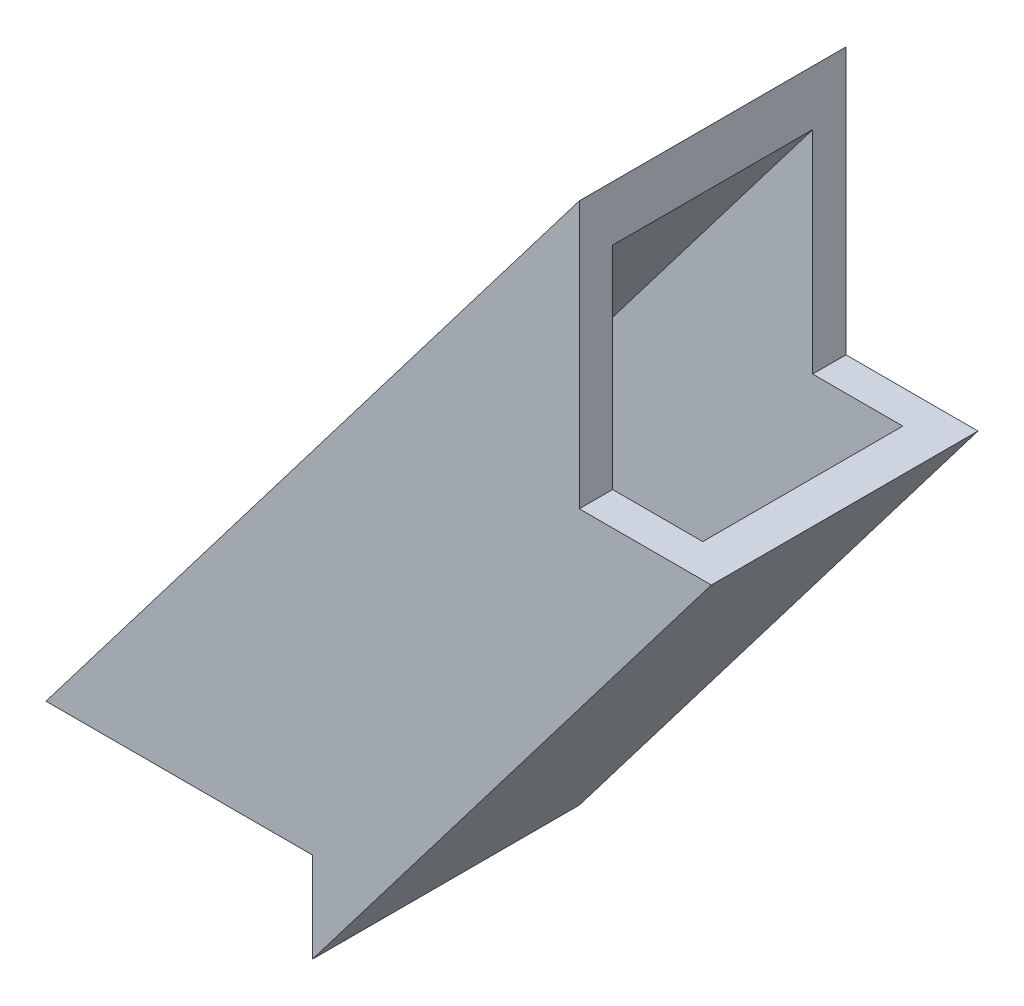
ISO-10303-21;
HEADER;
FILE_DESCRIPTION(('STEP AP214'),'2;1');
FILE_NAME('part.step','',(''),(''),'','','');
FILE_SCHEMA(('AUTOMOTIVE_DESIGN { 1 0 10303 214 1 1 1 1 }'));
ENDSEC;
DATA;
#1=APPLICATION_CONTEXT('core data for automotive mechanical design processes');
#2=APPLICATION_PROTOCOL_DEFINITION('international standard','automotive_design',2000,#1);
#3=PRODUCT_CONTEXT('',#1,'mechanical');
#4=PRODUCT('Part','Part','',(#3));
#5=PRODUCT_RELATED_PRODUCT_CATEGORY('part','',(#4));
#6=PRODUCT_DEFINITION_FORMATION('','',#4);
#7=PRODUCT_DEFINITION_CONTEXT('part definition',#1,'design');
#8=PRODUCT_DEFINITION('design','',#6,#7);
#9=PRODUCT_DEFINITION_SHAPE('','',#8);
#10=(LENGTH_UNIT() NAMED_UNIT(*) SI_UNIT(.MILLI.,.METRE.));
#11=(NAMED_UNIT(*) PLANE_ANGLE_UNIT() SI_UNIT($,.RADIAN.));
#12=(NAMED_UNIT(*) SI_UNIT($,.STERADIAN.) SOLID_ANGLE_UNIT());
#13=UNCERTAINTY_MEASURE_WITH_UNIT(LENGTH_MEASURE(1.E-05),#10,'distance_accuracy_value','');
#14=(GEOMETRIC_REPRESENTATION_CONTEXT(3) GLOBAL_UNCERTAINTY_ASSIGNED_CONTEXT((#13)) GLOBAL_UNIT_ASSIGNED_CONTEXT((#10,
#11,#12)) REPRESENTATION_CONTEXT('',''));
#15=CARTESIAN_POINT('',(0.,0.,0.));
#16=DIRECTION('',(0.,0.,1.));
#17=DIRECTION('',(1.,0.,0.));
#18=AXIS2_PLACEMENT_3D('',#15,#16,#17);
#19=CARTESIAN_POINT('',(317.5,92.075,76.1999999999998));
#20=DIRECTION('',(-0.795431720032499,0.606043215262856,0.));
#21=DIRECTION('',(-0.606043215262856,-0.795431720032499,0.));
#22=AXIS2_PLACEMENT_3D('',#19,#20,#21);
#23=PLANE('',#22);
#24=DIRECTION('',(-0.606043215262856,-0.795431720032499,0.));
#25=VECTOR('',#24,1.);
#26=CARTESIAN_POINT('',(317.5,92.075,76.1999999999998));
#27=LINE('',#26,#25);
#28=CARTESIAN_POINT('',(317.5,92.075,76.1999999999998));
#29=VERTEX_POINT('',#28);
#30=CARTESIAN_POINT('',(266.7,25.4,76.1999999999998));
#31=VERTEX_POINT('',#30);
#32=EDGE_CURVE('E136',#29,#31,#27,.T.);
#33=ORIENTED_EDGE('',*,*,#32,.T.);
#34=DIRECTION('',(0.,0.,-1.));
#35=VECTOR('',#34,1.);
#36=CARTESIAN_POINT('',(266.7,25.4,76.1999999999998));
#37=LINE('',#36,#35);
#38=CARTESIAN_POINT('',(266.7,25.4,101.6));
#39=VERTEX_POINT('',#38);
#40=EDGE_CURVE('E150',#39,#31,#37,.T.);
#41=ORIENTED_EDGE('',*,*,#40,.F.);
#42=DIRECTION('',(-0.606043215262856,-0.795431720032499,0.));
#43=VECTOR('',#42,1.);
#44=CARTESIAN_POINT('',(317.5,92.075,101.6));
#45=LINE('',#44,#43);
#46=CARTESIAN_POINT('',(317.5,92.075,101.6));
#47=VERTEX_POINT('',#46);
#48=EDGE_CURVE('E144',#47,#39,#45,.T.);
#49=ORIENTED_EDGE('',*,*,#48,.F.);
#50=DIRECTION('',(0.,0.,-1.));
#51=VECTOR('',#50,1.);
#52=CARTESIAN_POINT('',(317.5,92.075,76.1999999999998));
#53=LINE('',#52,#51);
#54=EDGE_CURVE('E123',#47,#29,#53,.T.);
#55=ORIENTED_EDGE('',*,*,#54,.T.);
#56=EDGE_LOOP('',(#33,#41,#49,#55));
#57=FACE_BOUND('',#56,.T.);
#58=ADVANCED_FACE('F35',(#57),#23,.T.);
#59=CARTESIAN_POINT('',(337.703965688825,76.6815023323235,76.1999999999998));
#60=DIRECTION('',(0.,0.,-1.));
#61=DIRECTION('',(-1.,0.,0.));
#62=AXIS2_PLACEMENT_3D('',#59,#60,#61);
#63=PLANE('',#62);
#64=ORIENTED_EDGE('',*,*,#32,.F.);
#65=DIRECTION('',(0.,-1.,0.));
#66=VECTOR('',#65,1.);
#67=CARTESIAN_POINT('',(317.5,76.6815023323235,76.1999999999998));
#68=LINE('',#67,#66);
#69=CARTESIAN_POINT('',(317.5,66.675,76.1999999999998));
#70=VERTEX_POINT('',#69);
#71=EDGE_CURVE('E131',#29,#70,#68,.T.);
#72=ORIENTED_EDGE('',*,*,#71,.T.);
#73=DIRECTION('',(1.,0.,0.));
#74=VECTOR('',#73,1.);
#75=CARTESIAN_POINT('',(337.703965688825,66.675,76.1999999999998));
#76=LINE('',#75,#74);
#77=CARTESIAN_POINT('',(330.079963911817,66.675,76.1999999999998));
#78=VERTEX_POINT('',#77);
#79=EDGE_CURVE('E195',#70,#78,#76,.T.);
#80=ORIENTED_EDGE('',*,*,#79,.T.);
#81=DIRECTION('',(-0.606043215262856,-0.795431720032499,0.));
#82=VECTOR('',#81,1.);
#83=CARTESIAN_POINT('',(337.703965688825,76.6815023323235,76.1999999999998));
#84=LINE('',#83,#82);
#85=CARTESIAN_POINT('',(292.1,16.82629736574,76.1999999999998));
#86=VERTEX_POINT('',#85);
#87=EDGE_CURVE('E156',#78,#86,#84,.T.);
#88=ORIENTED_EDGE('',*,*,#87,.T.);
#89=DIRECTION('',(0.,1.,0.));
#90=VECTOR('',#89,1.);
#91=CARTESIAN_POINT('',(292.1,76.6815023323235,76.1999999999998));
#92=LINE('',#91,#90);
#93=CARTESIAN_POINT('',(292.1,25.4,76.1999999999998));
#94=VERTEX_POINT('',#93);
#95=EDGE_CURVE('E201',#86,#94,#92,.T.);
#96=ORIENTED_EDGE('',*,*,#95,.T.);
#97=DIRECTION('',(-1.,0.,0.));
#98=VECTOR('',#97,1.);
#99=CARTESIAN_POINT('',(337.703965688825,25.4,76.1999999999998));
#100=LINE('',#99,#98);
#101=EDGE_CURVE('E207',#94,#31,#100,.T.);
#102=ORIENTED_EDGE('',*,*,#101,.T.);
#103=EDGE_LOOP('',(#64,#72,#80,#88,#96,#102));
#104=FACE_BOUND('',#103,.T.);
#105=ADVANCED_FACE('F227',(#104),#63,.T.);
#106=CARTESIAN_POINT('',(337.703965688825,76.6815023323235,76.1999999999998));
#107=DIRECTION('',(0.795431720032499,-0.606043215262856,0.));
#108=DIRECTION('',(0.606043215262856,0.795431720032499,0.));
#109=AXIS2_PLACEMENT_3D('',#106,#107,#108);
#110=PLANE('',#109);
#111=ORIENTED_EDGE('',*,*,#87,.F.);
#112=DIRECTION('',(0.,0.,1.));
#113=VECTOR('',#112,1.);
#114=CARTESIAN_POINT('',(330.079963911817,66.675,76.1999999999998));
#115=LINE('',#114,#113);
#116=CARTESIAN_POINT('',(330.079963911817,66.675,101.6));
#117=VERTEX_POINT('',#116);
#118=EDGE_CURVE('E192',#78,#117,#115,.T.);
#119=ORIENTED_EDGE('',*,*,#118,.T.);
#120=DIRECTION('',(-0.606043215262856,-0.795431720032499,0.));
#121=VECTOR('',#120,1.);
#122=CARTESIAN_POINT('',(337.703965688825,76.6815023323235,101.6));
#123=LINE('',#122,#121);
#124=CARTESIAN_POINT('',(292.1,16.8262973657399,101.6));
#125=VERTEX_POINT('',#124);
#126=EDGE_CURVE('E152',#117,#125,#123,.T.);
#127=ORIENTED_EDGE('',*,*,#126,.T.);
#128=DIRECTION('',(0.,0.,-1.));
#129=VECTOR('',#128,1.);
#130=CARTESIAN_POINT('',(292.1,16.82629736574,76.1999999999998));
#131=LINE('',#130,#129);
#132=EDGE_CURVE('E175',#125,#86,#131,.T.);
#133=ORIENTED_EDGE('',*,*,#132,.T.);
#134=EDGE_LOOP('',(#111,#119,#127,#133));
#135=FACE_BOUND('',#134,.T.);
#136=ADVANCED_FACE('F247',(#135),#110,.T.);
#137=CARTESIAN_POINT('',(337.703965688825,76.6815023323235,101.6));
#138=DIRECTION('',(0.,0.,1.));
#139=DIRECTION('',(1.,0.,0.));
#140=AXIS2_PLACEMENT_3D('',#137,#138,#139);
#141=PLANE('',#140);
#142=DIRECTION('',(1.,0.,0.));
#143=VECTOR('',#142,1.);
#144=CARTESIAN_POINT('',(342.9,66.675,101.6));
#145=LINE('',#144,#143);
#146=CARTESIAN_POINT('',(317.5,66.675,101.6));
#147=VERTEX_POINT('',#146);
#148=EDGE_CURVE('E147',#147,#117,#145,.T.);
#149=ORIENTED_EDGE('',*,*,#148,.F.);
#150=DIRECTION('',(0.,-1.,0.));
#151=VECTOR('',#150,1.);
#152=CARTESIAN_POINT('',(317.5,92.075,101.6));
#153=LINE('',#152,#151);
#154=EDGE_CURVE('E127',#47,#147,#153,.T.);
#155=ORIENTED_EDGE('',*,*,#154,.F.);
#156=ORIENTED_EDGE('',*,*,#48,.T.);
#157=DIRECTION('',(-1.,0.,0.));
#158=VECTOR('',#157,1.);
#159=CARTESIAN_POINT('',(292.1,25.4,101.6));
#160=LINE('',#159,#158);
#161=CARTESIAN_POINT('',(292.1,25.4,101.6));
#162=VERTEX_POINT('',#161);
#163=EDGE_CURVE('E219',#162,#39,#160,.T.);
#164=ORIENTED_EDGE('',*,*,#163,.F.);
#165=DIRECTION('',(0.,1.,0.));
#166=VECTOR('',#165,1.);
#167=CARTESIAN_POINT('',(292.1,-25.4,101.6));
#168=LINE('',#167,#166);
#169=EDGE_CURVE('E221',#125,#162,#168,.T.);
#170=ORIENTED_EDGE('',*,*,#169,.F.);
#171=ORIENTED_EDGE('',*,*,#126,.F.);
#172=EDGE_LOOP('',(#149,#155,#156,#164,#170,#171));
#173=FACE_BOUND('',#172,.T.);
#174=ADVANCED_FACE('F142',(#173),#141,.T.);
#175=CARTESIAN_POINT('',(292.1,-25.4,101.6));
#176=DIRECTION('',(-1.,0.,0.));
#177=DIRECTION('',(0.,0.,1.));
#178=AXIS2_PLACEMENT_3D('',#175,#176,#177);
#179=PLANE('',#178);
#180=ORIENTED_EDGE('',*,*,#169,.T.);
#181=DIRECTION('',(0.,0.,-1.));
#182=VECTOR('',#181,1.);
#183=CARTESIAN_POINT('',(292.1,25.4,101.6));
#184=LINE('',#183,#182);
#185=CARTESIAN_POINT('',(292.1,25.4,98.4249999999998));
#186=VERTEX_POINT('',#185);
#187=EDGE_CURVE('E148',#162,#186,#184,.T.);
#188=ORIENTED_EDGE('',*,*,#187,.T.);
#189=DIRECTION('',(0.,-1.,0.));
#190=VECTOR('',#189,1.);
#191=CARTESIAN_POINT('',(292.1,78.6056895407831,98.4249999999998));
#192=LINE('',#191,#190);
#193=CARTESIAN_POINT('',(292.1,22.0651976950225,98.4249999999998));
#194=VERTEX_POINT('',#193);
#195=EDGE_CURVE('E49',#186,#194,#192,.T.);
#196=ORIENTED_EDGE('',*,*,#195,.T.);
#197=DIRECTION('',(0.,0.,-1.));
#198=VECTOR('',#197,1.);
#199=CARTESIAN_POINT('',(292.1,22.0651976950225,79.3749999999998));
#200=LINE('',#199,#198);
#201=CARTESIAN_POINT('',(292.1,22.0651976950225,79.3749999999998));
#202=VERTEX_POINT('',#201);
#203=EDGE_CURVE('E151',#194,#202,#200,.T.);
#204=ORIENTED_EDGE('',*,*,#203,.T.);
#205=DIRECTION('',(0.,1.,0.));
#206=VECTOR('',#205,1.);
#207=CARTESIAN_POINT('',(292.1,78.6056895407831,79.3749999999998));
#208=LINE('',#207,#206);
#209=CARTESIAN_POINT('',(292.1,25.4,79.3749999999998));
#210=VERTEX_POINT('',#209);
#211=EDGE_CURVE('E204',#202,#210,#208,.T.);
#212=ORIENTED_EDGE('',*,*,#211,.T.);
#213=EDGE_CURVE('E218',#210,#94,#184,.T.);
#214=ORIENTED_EDGE('',*,*,#213,.T.);
#215=ORIENTED_EDGE('',*,*,#95,.F.);
#216=ORIENTED_EDGE('',*,*,#132,.F.);
#217=EDGE_LOOP('',(#180,#188,#196,#204,#212,#214,#215,#216));
#218=FACE_BOUND('',#217,.T.);
#219=ADVANCED_FACE('F234',(#218),#179,.T.);
#220=CARTESIAN_POINT('',(292.1,25.4,101.6));
#221=DIRECTION('',(0.,-1.,0.));
#222=DIRECTION('',(0.,0.,-1.));
#223=AXIS2_PLACEMENT_3D('',#220,#221,#222);
#224=PLANE('',#223);
#225=ORIENTED_EDGE('',*,*,#213,.F.);
#226=DIRECTION('',(-1.,0.,0.));
#227=VECTOR('',#226,1.);
#228=CARTESIAN_POINT('',(335.178469977722,25.4,79.3749999999998));
#229=LINE('',#228,#227);
#230=CARTESIAN_POINT('',(270.691543108025,25.4,79.3749999999998));
#231=VERTEX_POINT('',#230);
#232=EDGE_CURVE('E210',#210,#231,#229,.T.);
#233=ORIENTED_EDGE('',*,*,#232,.T.);
#234=DIRECTION('',(0.,0.,1.));
#235=VECTOR('',#234,1.);
#236=CARTESIAN_POINT('',(270.691543108025,25.4,79.3749999999998));
#237=LINE('',#236,#235);
#238=CARTESIAN_POINT('',(270.691543108025,25.4,98.4249999999998));
#239=VERTEX_POINT('',#238);
#240=EDGE_CURVE('E212',#231,#239,#237,.T.);
#241=ORIENTED_EDGE('',*,*,#240,.T.);
#242=DIRECTION('',(1.,0.,0.));
#243=VECTOR('',#242,1.);
#244=CARTESIAN_POINT('',(335.178469977722,25.4,98.4249999999998));
#245=LINE('',#244,#243);
#246=EDGE_CURVE('E214',#239,#186,#245,.T.);
#247=ORIENTED_EDGE('',*,*,#246,.T.);
#248=ORIENTED_EDGE('',*,*,#187,.F.);
#249=ORIENTED_EDGE('',*,*,#163,.T.);
#250=ORIENTED_EDGE('',*,*,#40,.T.);
#251=ORIENTED_EDGE('',*,*,#101,.F.);
#252=EDGE_LOOP('',(#225,#233,#241,#247,#248,#249,#250,#251));
#253=FACE_BOUND('',#252,.T.);
#254=ADVANCED_FACE('F232',(#253),#224,.T.);
#255=CARTESIAN_POINT('',(335.178469977722,78.6056895407831,79.3749999999998));
#256=DIRECTION('',(0.,0.,-1.));
#257=DIRECTION('',(-1.,0.,0.));
#258=AXIS2_PLACEMENT_3D('',#255,#256,#257);
#259=PLANE('',#258);
#260=DIRECTION('',(0.,-1.,0.));
#261=VECTOR('',#260,1.);
#262=CARTESIAN_POINT('',(317.5,78.6056895407831,79.3749999999998));
#263=LINE('',#262,#261);
#264=CARTESIAN_POINT('',(317.5,86.8360996707175,79.3749999999998));
#265=VERTEX_POINT('',#264);
#266=CARTESIAN_POINT('',(317.5,66.675,79.3749999999998));
#267=VERTEX_POINT('',#266);
#268=EDGE_CURVE('E188',#265,#267,#263,.T.);
#269=ORIENTED_EDGE('',*,*,#268,.F.);
#270=DIRECTION('',(-0.606043215262856,-0.795431720032499,0.));
#271=VECTOR('',#270,1.);
#272=CARTESIAN_POINT('',(320.025495711103,90.1508127915405,79.3749999999998));
#273=LINE('',#272,#271);
#274=EDGE_CURVE('E137',#265,#231,#273,.T.);
#275=ORIENTED_EDGE('',*,*,#274,.T.);
#276=ORIENTED_EDGE('',*,*,#232,.F.);
#277=ORIENTED_EDGE('',*,*,#211,.F.);
#278=DIRECTION('',(-0.606043215262856,-0.795431720032499,0.));
#279=VECTOR('',#278,1.);
#280=CARTESIAN_POINT('',(335.178469977722,78.6056895407831,79.3749999999998));
#281=LINE('',#280,#279);
#282=CARTESIAN_POINT('',(326.088420803792,66.675,79.3749999999998));
#283=VERTEX_POINT('',#282);
#284=EDGE_CURVE('E179',#283,#202,#281,.T.);
#285=ORIENTED_EDGE('',*,*,#284,.F.);
#286=DIRECTION('',(1.,0.,0.));
#287=VECTOR('',#286,1.);
#288=CARTESIAN_POINT('',(335.178469977722,66.675,79.3749999999998));
#289=LINE('',#288,#287);
#290=EDGE_CURVE('E57',#267,#283,#289,.T.);
#291=ORIENTED_EDGE('',*,*,#290,.F.);
#292=EDGE_LOOP('',(#269,#275,#276,#277,#285,#291));
#293=FACE_BOUND('',#292,.T.);
#294=ADVANCED_FACE('F237',(#293),#259,.F.);
#295=CARTESIAN_POINT('',(320.025495711103,90.1508127915405,79.3749999999998));
#296=DIRECTION('',(-0.795431720032499,0.606043215262856,0.));
#297=DIRECTION('',(-0.606043215262856,-0.795431720032499,0.));
#298=AXIS2_PLACEMENT_3D('',#295,#296,#297);
#299=PLANE('',#298);
#300=DIRECTION('',(0.,0.,-1.));
#301=VECTOR('',#300,1.);
#302=CARTESIAN_POINT('',(317.5,86.8360996707175,79.3749999999998));
#303=LINE('',#302,#301);
#304=CARTESIAN_POINT('',(317.5,86.8360996707175,98.4249999999998));
#305=VERTEX_POINT('',#304);
#306=EDGE_CURVE('E190',#305,#265,#303,.T.);
#307=ORIENTED_EDGE('',*,*,#306,.F.);
#308=DIRECTION('',(-0.606043215262856,-0.795431720032499,0.));
#309=VECTOR('',#308,1.);
#310=CARTESIAN_POINT('',(320.025495711103,90.1508127915405,98.4249999999998));
#311=LINE('',#310,#309);
#312=EDGE_CURVE('E178',#305,#239,#311,.T.);
#313=ORIENTED_EDGE('',*,*,#312,.T.);
#314=ORIENTED_EDGE('',*,*,#240,.F.);
#315=ORIENTED_EDGE('',*,*,#274,.F.);
#316=EDGE_LOOP('',(#307,#313,#314,#315));
#317=FACE_BOUND('',#316,.T.);
#318=ADVANCED_FACE('F243',(#317),#299,.F.);
#319=CARTESIAN_POINT('',(335.178469977722,78.6056895407831,98.4249999999998));
#320=DIRECTION('',(0.,0.,1.));
#321=DIRECTION('',(1.,0.,0.));
#322=AXIS2_PLACEMENT_3D('',#319,#320,#321);
#323=PLANE('',#322);
#324=DIRECTION('',(0.,1.,0.));
#325=VECTOR('',#324,1.);
#326=CARTESIAN_POINT('',(317.5,78.6056895407831,98.4249999999998));
#327=LINE('',#326,#325);
#328=CARTESIAN_POINT('',(317.5,66.675,98.4249999999998));
#329=VERTEX_POINT('',#328);
#330=EDGE_CURVE('E11',#329,#305,#327,.T.);
#331=ORIENTED_EDGE('',*,*,#330,.F.);
#332=DIRECTION('',(-1.,0.,0.));
#333=VECTOR('',#332,1.);
#334=CARTESIAN_POINT('',(335.178469977722,66.675,98.4249999999998));
#335=LINE('',#334,#333);
#336=CARTESIAN_POINT('',(326.088420803792,66.675,98.4249999999998));
#337=VERTEX_POINT('',#336);
#338=EDGE_CURVE('E164',#337,#329,#335,.T.);
#339=ORIENTED_EDGE('',*,*,#338,.F.);
#340=DIRECTION('',(-0.606043215262856,-0.795431720032499,0.));
#341=VECTOR('',#340,1.);
#342=CARTESIAN_POINT('',(335.178469977722,78.6056895407831,98.4249999999998));
#343=LINE('',#342,#341);
#344=EDGE_CURVE('E173',#337,#194,#343,.T.);
#345=ORIENTED_EDGE('',*,*,#344,.T.);
#346=ORIENTED_EDGE('',*,*,#195,.F.);
#347=ORIENTED_EDGE('',*,*,#246,.F.);
#348=ORIENTED_EDGE('',*,*,#312,.F.);
#349=EDGE_LOOP('',(#331,#339,#345,#346,#347,#348));
#350=FACE_BOUND('',#349,.T.);
#351=ADVANCED_FACE('F172',(#350),#323,.F.);
#352=CARTESIAN_POINT('',(335.178469977722,78.6056895407831,79.3749999999998));
#353=DIRECTION('',(0.795431720032499,-0.606043215262856,0.));
#354=DIRECTION('',(0.606043215262856,0.795431720032499,0.));
#355=AXIS2_PLACEMENT_3D('',#352,#353,#354);
#356=PLANE('',#355);
#357=DIRECTION('',(0.,0.,1.));
#358=VECTOR('',#357,1.);
#359=CARTESIAN_POINT('',(326.088420803792,66.675,79.3749999999998));
#360=LINE('',#359,#358);
#361=EDGE_CURVE('E42',#283,#337,#360,.T.);
#362=ORIENTED_EDGE('',*,*,#361,.F.);
#363=ORIENTED_EDGE('',*,*,#284,.T.);
#364=ORIENTED_EDGE('',*,*,#203,.F.);
#365=ORIENTED_EDGE('',*,*,#344,.F.);
#366=EDGE_LOOP('',(#362,#363,#364,#365));
#367=FACE_BOUND('',#366,.T.);
#368=ADVANCED_FACE('F177',(#367),#356,.F.);
#369=CARTESIAN_POINT('',(317.5,92.075,101.6));
#370=DIRECTION('',(1.,0.,0.));
#371=DIRECTION('',(0.,0.,-1.));
#372=AXIS2_PLACEMENT_3D('',#369,#370,#371);
#373=PLANE('',#372);
#374=ORIENTED_EDGE('',*,*,#54,.F.);
#375=ORIENTED_EDGE('',*,*,#154,.T.);
#376=DIRECTION('',(0.,0.,-1.));
#377=VECTOR('',#376,1.);
#378=CARTESIAN_POINT('',(317.5,66.675,101.6));
#379=LINE('',#378,#377);
#380=EDGE_CURVE('E216',#147,#329,#379,.T.);
#381=ORIENTED_EDGE('',*,*,#380,.T.);
#382=ORIENTED_EDGE('',*,*,#330,.T.);
#383=ORIENTED_EDGE('',*,*,#306,.T.);
#384=ORIENTED_EDGE('',*,*,#268,.T.);
#385=EDGE_CURVE('E224',#267,#70,#379,.T.);
#386=ORIENTED_EDGE('',*,*,#385,.T.);
#387=ORIENTED_EDGE('',*,*,#71,.F.);
#388=EDGE_LOOP('',(#374,#375,#381,#382,#383,#384,#386,#387));
#389=FACE_BOUND('',#388,.T.);
#390=ADVANCED_FACE('F125',(#389),#373,.T.);
#391=CARTESIAN_POINT('',(342.9,66.675,101.6));
#392=DIRECTION('',(0.,1.,0.));
#393=DIRECTION('',(0.,0.,1.));
#394=AXIS2_PLACEMENT_3D('',#391,#392,#393);
#395=PLANE('',#394);
#396=ORIENTED_EDGE('',*,*,#79,.F.);
#397=ORIENTED_EDGE('',*,*,#385,.F.);
#398=ORIENTED_EDGE('',*,*,#290,.T.);
#399=ORIENTED_EDGE('',*,*,#361,.T.);
#400=ORIENTED_EDGE('',*,*,#338,.T.);
#401=ORIENTED_EDGE('',*,*,#380,.F.);
#402=ORIENTED_EDGE('',*,*,#148,.T.);
#403=ORIENTED_EDGE('',*,*,#118,.F.);
#404=EDGE_LOOP('',(#396,#397,#398,#399,#400,#401,#402,#403));
#405=FACE_BOUND('',#404,.T.);
#406=ADVANCED_FACE('F163',(#405),#395,.T.);
#407=CLOSED_SHELL('',(#58,#105,#136,#174,#219,#254,#294,#318,#351,#368,#390,#406));
#408=MANIFOLD_SOLID_BREP('B2',#407);
#409=ADVANCED_BREP_SHAPE_REPRESENTATION('',(#18,#408),#14);
#410=SHAPE_DEFINITION_REPRESENTATION(#9,#409);
ENDSEC;
END-ISO-10303-21;
